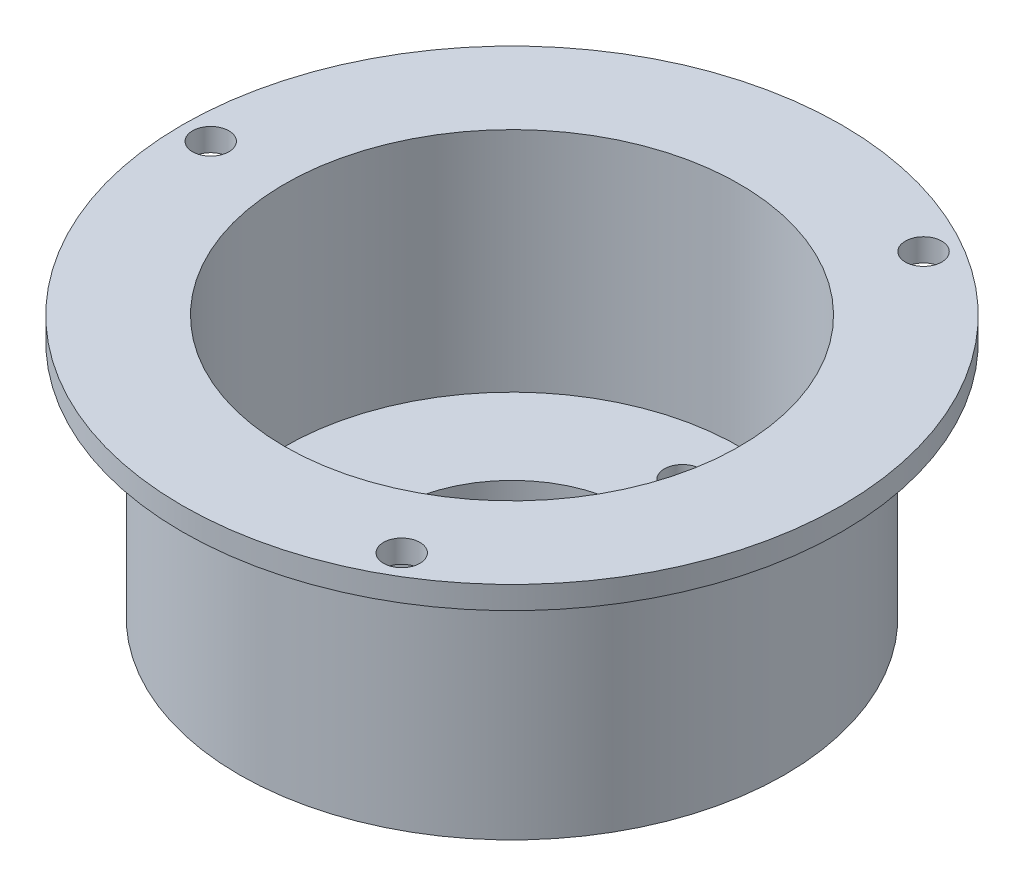
ISO-10303-21;
HEADER;
FILE_DESCRIPTION(('STEP AP214'),'2;1');
FILE_NAME('part.step','',(''),(''),'','','');
FILE_SCHEMA(('AUTOMOTIVE_DESIGN { 1 0 10303 214 1 1 1 1 }'));
ENDSEC;
DATA;
#1=APPLICATION_CONTEXT('core data for automotive mechanical design processes');
#2=APPLICATION_PROTOCOL_DEFINITION('international standard','automotive_design',2000,#1);
#3=PRODUCT_CONTEXT('',#1,'mechanical');
#4=PRODUCT('Part','Part','',(#3));
#5=PRODUCT_RELATED_PRODUCT_CATEGORY('part','',(#4));
#6=PRODUCT_DEFINITION_FORMATION('','',#4);
#7=PRODUCT_DEFINITION_CONTEXT('part definition',#1,'design');
#8=PRODUCT_DEFINITION('design','',#6,#7);
#9=PRODUCT_DEFINITION_SHAPE('','',#8);
#10=(LENGTH_UNIT() NAMED_UNIT(*) SI_UNIT(.MILLI.,.METRE.));
#11=(NAMED_UNIT(*) PLANE_ANGLE_UNIT() SI_UNIT($,.RADIAN.));
#12=(NAMED_UNIT(*) SI_UNIT($,.STERADIAN.) SOLID_ANGLE_UNIT());
#13=UNCERTAINTY_MEASURE_WITH_UNIT(LENGTH_MEASURE(1.E-05),#10,'distance_accuracy_value','');
#14=(GEOMETRIC_REPRESENTATION_CONTEXT(3) GLOBAL_UNCERTAINTY_ASSIGNED_CONTEXT((#13)) GLOBAL_UNIT_ASSIGNED_CONTEXT((#10,
#11,#12)) REPRESENTATION_CONTEXT('',''));
#15=CARTESIAN_POINT('',(0.,0.,0.));
#16=DIRECTION('',(0.,0.,1.));
#17=DIRECTION('',(1.,0.,0.));
#18=AXIS2_PLACEMENT_3D('',#15,#16,#17);
#19=CARTESIAN_POINT('',(0.,18.,0.));
#20=DIRECTION('',(0.,-1.,0.));
#21=DIRECTION('',(0.,0.,-1.));
#22=AXIS2_PLACEMENT_3D('',#19,#20,#21);
#23=CYLINDRICAL_SURFACE('',#22,24.);
#24=CARTESIAN_POINT('',(0.,18.,0.));
#25=DIRECTION('',(0.,1.,0.));
#26=DIRECTION('',(0.,0.,1.));
#27=AXIS2_PLACEMENT_3D('',#24,#25,#26);
#28=CIRCLE('',#27,24.);
#29=CARTESIAN_POINT('',(0.,18.,24.));
#30=VERTEX_POINT('',#29);
#31=EDGE_CURVE('E10',#30,#30,#28,.T.);
#32=ORIENTED_EDGE('',*,*,#31,.F.);
#33=EDGE_LOOP('',(#32));
#34=FACE_BOUND('',#33,.T.);
#35=CARTESIAN_POINT('',(0.,-3.,0.));
#36=DIRECTION('',(0.,1.,0.));
#37=DIRECTION('',(0.,0.,1.));
#38=AXIS2_PLACEMENT_3D('',#35,#36,#37);
#39=CIRCLE('',#38,24.);
#40=CARTESIAN_POINT('',(0.,-3.,24.));
#41=VERTEX_POINT('',#40);
#42=EDGE_CURVE('E42',#41,#41,#39,.T.);
#43=ORIENTED_EDGE('',*,*,#42,.T.);
#44=EDGE_LOOP('',(#43));
#45=FACE_BOUND('',#44,.T.);
#46=ADVANCED_FACE('F32',(#34,#45),#23,.T.);
#47=CARTESIAN_POINT('',(0.,18.,0.));
#48=DIRECTION('',(0.,-1.,0.));
#49=DIRECTION('',(0.,0.,-1.));
#50=AXIS2_PLACEMENT_3D('',#47,#48,#49);
#51=CYLINDRICAL_SURFACE('',#50,20.);
#52=CARTESIAN_POINT('',(0.,0.,0.));
#53=DIRECTION('',(0.,1.,0.));
#54=DIRECTION('',(0.,0.,1.));
#55=AXIS2_PLACEMENT_3D('',#52,#53,#54);
#56=CIRCLE('',#55,20.);
#57=CARTESIAN_POINT('',(0.,0.,20.));
#58=VERTEX_POINT('',#57);
#59=EDGE_CURVE('E38',#58,#58,#56,.T.);
#60=ORIENTED_EDGE('',*,*,#59,.F.);
#61=EDGE_LOOP('',(#60));
#62=FACE_BOUND('',#61,.T.);
#63=CARTESIAN_POINT('',(0.,20.,0.));
#64=DIRECTION('',(0.,1.,0.));
#65=DIRECTION('',(0.,0.,1.));
#66=AXIS2_PLACEMENT_3D('',#63,#64,#65);
#67=CIRCLE('',#66,20.);
#68=CARTESIAN_POINT('',(0.,20.,20.));
#69=VERTEX_POINT('',#68);
#70=EDGE_CURVE('E76',#69,#69,#67,.T.);
#71=ORIENTED_EDGE('',*,*,#70,.T.);
#72=EDGE_LOOP('',(#71));
#73=FACE_BOUND('',#72,.T.);
#74=ADVANCED_FACE('F122',(#62,#73),#51,.F.);
#75=CARTESIAN_POINT('',(0.,0.,0.));
#76=DIRECTION('',(0.,1.,0.));
#77=DIRECTION('',(0.,0.,1.));
#78=AXIS2_PLACEMENT_3D('',#75,#76,#77);
#79=PLANE('',#78);
#80=CARTESIAN_POINT('',(0.,0.,0.));
#81=DIRECTION('',(0.,1.,0.));
#82=DIRECTION('',(0.,0.,1.));
#83=AXIS2_PLACEMENT_3D('',#80,#81,#82);
#84=CIRCLE('',#83,10.5);
#85=CARTESIAN_POINT('',(0.,0.,10.5));
#86=VERTEX_POINT('',#85);
#87=EDGE_CURVE('E49',#86,#86,#84,.T.);
#88=ORIENTED_EDGE('',*,*,#87,.F.);
#89=EDGE_LOOP('',(#88));
#90=FACE_BOUND('',#89,.T.);
#91=CARTESIAN_POINT('',(0.,0.,-15.));
#92=DIRECTION('',(0.,1.,0.));
#93=DIRECTION('',(0.,0.,1.));
#94=AXIS2_PLACEMENT_3D('',#91,#92,#93);
#95=CIRCLE('',#94,1.6);
#96=CARTESIAN_POINT('',(0.,0.,-13.4));
#97=VERTEX_POINT('',#96);
#98=EDGE_CURVE('E55',#97,#97,#95,.T.);
#99=ORIENTED_EDGE('',*,*,#98,.F.);
#100=EDGE_LOOP('',(#99));
#101=FACE_BOUND('',#100,.T.);
#102=CARTESIAN_POINT('',(12.9903810567675,0.,7.49999999999945));
#103=DIRECTION('',(0.,1.,0.));
#104=DIRECTION('',(0.,0.,1.));
#105=AXIS2_PLACEMENT_3D('',#102,#103,#104);
#106=CIRCLE('',#105,1.60000000000082);
#107=CARTESIAN_POINT('',(12.9903810567675,0.,9.10000000000027));
#108=VERTEX_POINT('',#107);
#109=EDGE_CURVE('E61',#108,#108,#106,.T.);
#110=ORIENTED_EDGE('',*,*,#109,.F.);
#111=EDGE_LOOP('',(#110));
#112=FACE_BOUND('',#111,.T.);
#113=CARTESIAN_POINT('',(-12.9903810567656,0.,7.50000000000056));
#114=DIRECTION('',(0.,1.,0.));
#115=DIRECTION('',(0.,0.,1.));
#116=AXIS2_PLACEMENT_3D('',#113,#114,#115);
#117=CIRCLE('',#116,1.60000000000122);
#118=CARTESIAN_POINT('',(-12.9903810567656,0.,9.10000000000177));
#119=VERTEX_POINT('',#118);
#120=EDGE_CURVE('E67',#119,#119,#117,.T.);
#121=ORIENTED_EDGE('',*,*,#120,.F.);
#122=EDGE_LOOP('',(#121));
#123=FACE_BOUND('',#122,.T.);
#124=ORIENTED_EDGE('',*,*,#59,.T.);
#125=EDGE_LOOP('',(#124));
#126=FACE_BOUND('',#125,.T.);
#127=ADVANCED_FACE('F127',(#90,#101,#112,#123,#126),#79,.T.);
#128=CARTESIAN_POINT('',(0.,-3.,0.));
#129=DIRECTION('',(0.,1.,0.));
#130=DIRECTION('',(0.,0.,1.));
#131=AXIS2_PLACEMENT_3D('',#128,#129,#130);
#132=PLANE('',#131);
#133=CARTESIAN_POINT('',(-12.9903810567656,-3.,7.50000000000056));
#134=DIRECTION('',(0.,1.,0.));
#135=DIRECTION('',(0.,0.,1.));
#136=AXIS2_PLACEMENT_3D('',#133,#134,#135);
#137=CIRCLE('',#136,1.60000000000122);
#138=CARTESIAN_POINT('',(-12.9903810567656,-3.,9.10000000000177));
#139=VERTEX_POINT('',#138);
#140=EDGE_CURVE('E64',#139,#139,#137,.T.);
#141=ORIENTED_EDGE('',*,*,#140,.T.);
#142=EDGE_LOOP('',(#141));
#143=FACE_BOUND('',#142,.T.);
#144=CARTESIAN_POINT('',(12.9903810567675,-3.,7.49999999999945));
#145=DIRECTION('',(0.,1.,0.));
#146=DIRECTION('',(0.,0.,1.));
#147=AXIS2_PLACEMENT_3D('',#144,#145,#146);
#148=CIRCLE('',#147,1.60000000000082);
#149=CARTESIAN_POINT('',(12.9903810567675,-3.,9.10000000000027));
#150=VERTEX_POINT('',#149);
#151=EDGE_CURVE('E58',#150,#150,#148,.T.);
#152=ORIENTED_EDGE('',*,*,#151,.T.);
#153=EDGE_LOOP('',(#152));
#154=FACE_BOUND('',#153,.T.);
#155=CARTESIAN_POINT('',(0.,-3.,-15.));
#156=DIRECTION('',(0.,1.,0.));
#157=DIRECTION('',(0.,0.,1.));
#158=AXIS2_PLACEMENT_3D('',#155,#156,#157);
#159=CIRCLE('',#158,1.6);
#160=CARTESIAN_POINT('',(0.,-3.,-13.4));
#161=VERTEX_POINT('',#160);
#162=EDGE_CURVE('E52',#161,#161,#159,.T.);
#163=ORIENTED_EDGE('',*,*,#162,.T.);
#164=EDGE_LOOP('',(#163));
#165=FACE_BOUND('',#164,.T.);
#166=CARTESIAN_POINT('',(0.,-3.,0.));
#167=DIRECTION('',(0.,1.,0.));
#168=DIRECTION('',(0.,0.,1.));
#169=AXIS2_PLACEMENT_3D('',#166,#167,#168);
#170=CIRCLE('',#169,10.5);
#171=CARTESIAN_POINT('',(0.,-3.,10.5));
#172=VERTEX_POINT('',#171);
#173=EDGE_CURVE('E46',#172,#172,#170,.T.);
#174=ORIENTED_EDGE('',*,*,#173,.T.);
#175=EDGE_LOOP('',(#174));
#176=FACE_BOUND('',#175,.T.);
#177=ORIENTED_EDGE('',*,*,#42,.F.);
#178=EDGE_LOOP('',(#177));
#179=FACE_BOUND('',#178,.T.);
#180=ADVANCED_FACE('F132',(#143,#154,#165,#176,#179),#132,.F.);
#181=CARTESIAN_POINT('',(0.,-3.,0.));
#182=DIRECTION('',(0.,1.,0.));
#183=DIRECTION('',(0.,0.,1.));
#184=AXIS2_PLACEMENT_3D('',#181,#182,#183);
#185=CYLINDRICAL_SURFACE('',#184,10.5);
#186=ORIENTED_EDGE('',*,*,#173,.F.);
#187=EDGE_LOOP('',(#186));
#188=FACE_BOUND('',#187,.T.);
#189=ORIENTED_EDGE('',*,*,#87,.T.);
#190=EDGE_LOOP('',(#189));
#191=FACE_BOUND('',#190,.T.);
#192=ADVANCED_FACE('F134',(#188,#191),#185,.F.);
#193=CARTESIAN_POINT('',(0.,-3.,-15.));
#194=DIRECTION('',(0.,1.,0.));
#195=DIRECTION('',(0.,0.,1.));
#196=AXIS2_PLACEMENT_3D('',#193,#194,#195);
#197=CYLINDRICAL_SURFACE('',#196,1.6);
#198=ORIENTED_EDGE('',*,*,#162,.F.);
#199=EDGE_LOOP('',(#198));
#200=FACE_BOUND('',#199,.T.);
#201=ORIENTED_EDGE('',*,*,#98,.T.);
#202=EDGE_LOOP('',(#201));
#203=FACE_BOUND('',#202,.T.);
#204=ADVANCED_FACE('F141',(#200,#203),#197,.F.);
#205=CARTESIAN_POINT('',(12.9903810567675,-3.,7.49999999999945));
#206=DIRECTION('',(0.,1.,0.));
#207=DIRECTION('',(0.,0.,1.));
#208=AXIS2_PLACEMENT_3D('',#205,#206,#207);
#209=CYLINDRICAL_SURFACE('',#208,1.60000000000082);
#210=ORIENTED_EDGE('',*,*,#151,.F.);
#211=EDGE_LOOP('',(#210));
#212=FACE_BOUND('',#211,.T.);
#213=ORIENTED_EDGE('',*,*,#109,.T.);
#214=EDGE_LOOP('',(#213));
#215=FACE_BOUND('',#214,.T.);
#216=ADVANCED_FACE('F115',(#212,#215),#209,.F.);
#217=CARTESIAN_POINT('',(-12.9903810567656,-3.,7.50000000000056));
#218=DIRECTION('',(0.,1.,0.));
#219=DIRECTION('',(0.,0.,1.));
#220=AXIS2_PLACEMENT_3D('',#217,#218,#219);
#221=CYLINDRICAL_SURFACE('',#220,1.60000000000122);
#222=ORIENTED_EDGE('',*,*,#140,.F.);
#223=EDGE_LOOP('',(#222));
#224=FACE_BOUND('',#223,.T.);
#225=ORIENTED_EDGE('',*,*,#120,.T.);
#226=EDGE_LOOP('',(#225));
#227=FACE_BOUND('',#226,.T.);
#228=ADVANCED_FACE('F106',(#224,#227),#221,.F.);
#229=CARTESIAN_POINT('',(0.,20.,0.));
#230=DIRECTION('',(0.,1.,0.));
#231=DIRECTION('',(0.,0.,1.));
#232=AXIS2_PLACEMENT_3D('',#229,#230,#231);
#233=PLANE('',#232);
#234=CARTESIAN_POINT('',(13.2500000000001,20.,-22.9496732002876));
#235=DIRECTION('',(0.,1.,0.));
#236=DIRECTION('',(0.,0.,1.));
#237=AXIS2_PLACEMENT_3D('',#234,#235,#236);
#238=CIRCLE('',#237,1.6);
#239=CARTESIAN_POINT('',(13.2500000000001,20.,-21.3496732002876));
#240=VERTEX_POINT('',#239);
#241=EDGE_CURVE('E85',#240,#240,#238,.T.);
#242=ORIENTED_EDGE('',*,*,#241,.F.);
#243=EDGE_LOOP('',(#242));
#244=FACE_BOUND('',#243,.T.);
#245=ORIENTED_EDGE('',*,*,#70,.F.);
#246=EDGE_LOOP('',(#245));
#247=FACE_BOUND('',#246,.T.);
#248=CARTESIAN_POINT('',(0.,20.,0.));
#249=DIRECTION('',(0.,1.,0.));
#250=DIRECTION('',(0.,0.,1.));
#251=AXIS2_PLACEMENT_3D('',#248,#249,#250);
#252=CIRCLE('',#251,29.);
#253=CARTESIAN_POINT('',(0.,20.,29.));
#254=VERTEX_POINT('',#253);
#255=EDGE_CURVE('E70',#254,#254,#252,.T.);
#256=ORIENTED_EDGE('',*,*,#255,.T.);
#257=EDGE_LOOP('',(#256));
#258=FACE_BOUND('',#257,.T.);
#259=CARTESIAN_POINT('',(-26.5,20.,0.));
#260=DIRECTION('',(0.,1.,0.));
#261=DIRECTION('',(0.,0.,1.));
#262=AXIS2_PLACEMENT_3D('',#259,#260,#261);
#263=CIRCLE('',#262,1.6);
#264=CARTESIAN_POINT('',(-26.5,20.,1.6));
#265=VERTEX_POINT('',#264);
#266=EDGE_CURVE('E81',#265,#265,#263,.T.);
#267=ORIENTED_EDGE('',*,*,#266,.F.);
#268=EDGE_LOOP('',(#267));
#269=FACE_BOUND('',#268,.T.);
#270=CARTESIAN_POINT('',(13.2499999999998,20.,22.9496732002877));
#271=DIRECTION('',(0.,1.,0.));
#272=DIRECTION('',(0.,0.,1.));
#273=AXIS2_PLACEMENT_3D('',#270,#271,#272);
#274=CIRCLE('',#273,1.6);
#275=CARTESIAN_POINT('',(13.2499999999998,20.,24.5496732002877));
#276=VERTEX_POINT('',#275);
#277=EDGE_CURVE('E91',#276,#276,#274,.T.);
#278=ORIENTED_EDGE('',*,*,#277,.F.);
#279=EDGE_LOOP('',(#278));
#280=FACE_BOUND('',#279,.T.);
#281=ADVANCED_FACE('F103',(#244,#247,#258,#269,#280),#233,.T.);
#282=CARTESIAN_POINT('',(0.,18.,0.));
#283=DIRECTION('',(0.,1.,0.));
#284=DIRECTION('',(0.,0.,1.));
#285=AXIS2_PLACEMENT_3D('',#282,#283,#284);
#286=PLANE('',#285);
#287=ORIENTED_EDGE('',*,*,#31,.T.);
#288=EDGE_LOOP('',(#287));
#289=FACE_BOUND('',#288,.T.);
#290=CARTESIAN_POINT('',(0.,18.,0.));
#291=DIRECTION('',(0.,1.,0.));
#292=DIRECTION('',(0.,0.,1.));
#293=AXIS2_PLACEMENT_3D('',#290,#291,#292);
#294=CIRCLE('',#293,29.);
#295=CARTESIAN_POINT('',(0.,18.,29.));
#296=VERTEX_POINT('',#295);
#297=EDGE_CURVE('E73',#296,#296,#294,.T.);
#298=ORIENTED_EDGE('',*,*,#297,.F.);
#299=EDGE_LOOP('',(#298));
#300=FACE_BOUND('',#299,.T.);
#301=CARTESIAN_POINT('',(-26.5,18.,0.));
#302=DIRECTION('',(0.,1.,0.));
#303=DIRECTION('',(0.,0.,1.));
#304=AXIS2_PLACEMENT_3D('',#301,#302,#303);
#305=CIRCLE('',#304,1.6);
#306=CARTESIAN_POINT('',(-26.5,18.,1.6));
#307=VERTEX_POINT('',#306);
#308=EDGE_CURVE('E82',#307,#307,#305,.T.);
#309=ORIENTED_EDGE('',*,*,#308,.T.);
#310=EDGE_LOOP('',(#309));
#311=FACE_BOUND('',#310,.T.);
#312=CARTESIAN_POINT('',(13.2500000000001,18.,-22.9496732002876));
#313=DIRECTION('',(0.,1.,0.));
#314=DIRECTION('',(0.,0.,1.));
#315=AXIS2_PLACEMENT_3D('',#312,#313,#314);
#316=CIRCLE('',#315,1.6);
#317=CARTESIAN_POINT('',(13.2500000000001,18.,-21.3496732002876));
#318=VERTEX_POINT('',#317);
#319=EDGE_CURVE('E88',#318,#318,#316,.T.);
#320=ORIENTED_EDGE('',*,*,#319,.T.);
#321=EDGE_LOOP('',(#320));
#322=FACE_BOUND('',#321,.T.);
#323=CARTESIAN_POINT('',(13.2499999999998,18.,22.9496732002877));
#324=DIRECTION('',(0.,1.,0.));
#325=DIRECTION('',(0.,0.,1.));
#326=AXIS2_PLACEMENT_3D('',#323,#324,#325);
#327=CIRCLE('',#326,1.6);
#328=CARTESIAN_POINT('',(13.2499999999998,18.,24.5496732002877));
#329=VERTEX_POINT('',#328);
#330=EDGE_CURVE('E94',#329,#329,#327,.T.);
#331=ORIENTED_EDGE('',*,*,#330,.T.);
#332=EDGE_LOOP('',(#331));
#333=FACE_BOUND('',#332,.T.);
#334=ADVANCED_FACE('F105',(#289,#300,#311,#322,#333),#286,.F.);
#335=CARTESIAN_POINT('',(0.,20.,0.));
#336=DIRECTION('',(0.,-1.,0.));
#337=DIRECTION('',(0.,0.,-1.));
#338=AXIS2_PLACEMENT_3D('',#335,#336,#337);
#339=CYLINDRICAL_SURFACE('',#338,29.);
#340=ORIENTED_EDGE('',*,*,#255,.F.);
#341=EDGE_LOOP('',(#340));
#342=FACE_BOUND('',#341,.T.);
#343=ORIENTED_EDGE('',*,*,#297,.T.);
#344=EDGE_LOOP('',(#343));
#345=FACE_BOUND('',#344,.T.);
#346=ADVANCED_FACE('F113',(#342,#345),#339,.T.);
#347=CARTESIAN_POINT('',(-26.5,20.,0.));
#348=DIRECTION('',(0.,-1.,0.));
#349=DIRECTION('',(0.,0.,-1.));
#350=AXIS2_PLACEMENT_3D('',#347,#348,#349);
#351=CYLINDRICAL_SURFACE('',#350,1.6);
#352=ORIENTED_EDGE('',*,*,#266,.T.);
#353=EDGE_LOOP('',(#352));
#354=FACE_BOUND('',#353,.T.);
#355=ORIENTED_EDGE('',*,*,#308,.F.);
#356=EDGE_LOOP('',(#355));
#357=FACE_BOUND('',#356,.T.);
#358=ADVANCED_FACE('F155',(#354,#357),#351,.F.);
#359=CARTESIAN_POINT('',(13.2500000000001,20.,-22.9496732002876));
#360=DIRECTION('',(0.,-1.,0.));
#361=DIRECTION('',(0.,0.,-1.));
#362=AXIS2_PLACEMENT_3D('',#359,#360,#361);
#363=CYLINDRICAL_SURFACE('',#362,1.6);
#364=ORIENTED_EDGE('',*,*,#241,.T.);
#365=EDGE_LOOP('',(#364));
#366=FACE_BOUND('',#365,.T.);
#367=ORIENTED_EDGE('',*,*,#319,.F.);
#368=EDGE_LOOP('',(#367));
#369=FACE_BOUND('',#368,.T.);
#370=ADVANCED_FACE('F160',(#366,#369),#363,.F.);
#371=CARTESIAN_POINT('',(13.2499999999998,20.,22.9496732002877));
#372=DIRECTION('',(0.,-1.,0.));
#373=DIRECTION('',(0.,0.,-1.));
#374=AXIS2_PLACEMENT_3D('',#371,#372,#373);
#375=CYLINDRICAL_SURFACE('',#374,1.6);
#376=ORIENTED_EDGE('',*,*,#277,.T.);
#377=EDGE_LOOP('',(#376));
#378=FACE_BOUND('',#377,.T.);
#379=ORIENTED_EDGE('',*,*,#330,.F.);
#380=EDGE_LOOP('',(#379));
#381=FACE_BOUND('',#380,.T.);
#382=ADVANCED_FACE('F100',(#378,#381),#375,.F.);
#383=CLOSED_SHELL('',(#46,#74,#127,#180,#192,#204,#216,#228,#281,#334,#346,#358,#370,#382));
#384=MANIFOLD_SOLID_BREP('B2',#383);
#385=ADVANCED_BREP_SHAPE_REPRESENTATION('',(#18,#384),#14);
#386=SHAPE_DEFINITION_REPRESENTATION(#9,#385);
ENDSEC;
END-ISO-10303-21;
